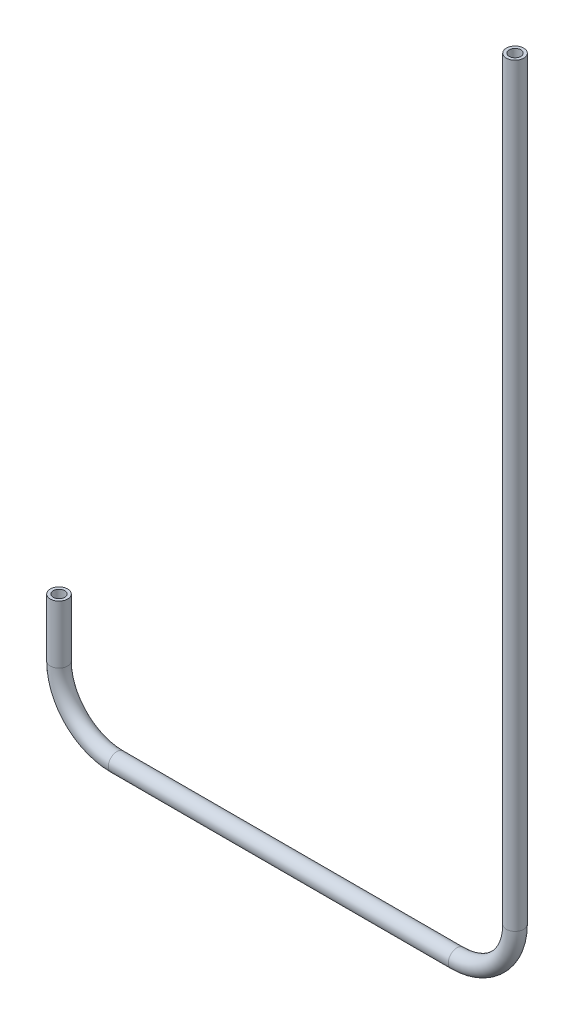
ISO-10303-21;
HEADER;
FILE_DESCRIPTION(('STEP AP214'),'2;1');
FILE_NAME('part.step','',(''),(''),'','','');
FILE_SCHEMA(('AUTOMOTIVE_DESIGN { 1 0 10303 214 1 1 1 1 }'));
ENDSEC;
DATA;
#1=APPLICATION_CONTEXT('core data for automotive mechanical design processes');
#2=APPLICATION_PROTOCOL_DEFINITION('international standard','automotive_design',2000,#1);
#3=PRODUCT_CONTEXT('',#1,'mechanical');
#4=PRODUCT('Part','Part','',(#3));
#5=PRODUCT_RELATED_PRODUCT_CATEGORY('part','',(#4));
#6=PRODUCT_DEFINITION_FORMATION('','',#4);
#7=PRODUCT_DEFINITION_CONTEXT('part definition',#1,'design');
#8=PRODUCT_DEFINITION('design','',#6,#7);
#9=PRODUCT_DEFINITION_SHAPE('','',#8);
#10=(LENGTH_UNIT() NAMED_UNIT(*) SI_UNIT(.MILLI.,.METRE.));
#11=(NAMED_UNIT(*) PLANE_ANGLE_UNIT() SI_UNIT($,.RADIAN.));
#12=(NAMED_UNIT(*) SI_UNIT($,.STERADIAN.) SOLID_ANGLE_UNIT());
#13=UNCERTAINTY_MEASURE_WITH_UNIT(LENGTH_MEASURE(1.E-05),#10,'distance_accuracy_value','');
#14=(GEOMETRIC_REPRESENTATION_CONTEXT(3) GLOBAL_UNCERTAINTY_ASSIGNED_CONTEXT((#13)) GLOBAL_UNIT_ASSIGNED_CONTEXT((#10,
#11,#12)) REPRESENTATION_CONTEXT('',''));
#15=CARTESIAN_POINT('',(0.,0.,0.));
#16=DIRECTION('',(0.,0.,1.));
#17=DIRECTION('',(1.,0.,0.));
#18=AXIS2_PLACEMENT_3D('',#15,#16,#17);
#19=CARTESIAN_POINT('',(0.,10.,0.));
#20=DIRECTION('',(0.,-1.,0.));
#21=DIRECTION('',(1.,0.,0.));
#22=AXIS2_PLACEMENT_3D('',#19,#20,#21);
#23=CYLINDRICAL_SURFACE('',#22,0.75);
#24=CARTESIAN_POINT('',(0.,5.,0.));
#25=DIRECTION('',(0.,-1.,0.));
#26=DIRECTION('',(1.,0.,0.));
#27=AXIS2_PLACEMENT_3D('',#24,#25,#26);
#28=CIRCLE('',#27,0.75);
#29=CARTESIAN_POINT('',(0.75,5.,0.));
#30=VERTEX_POINT('',#29);
#31=CARTESIAN_POINT('',(-0.75,5.,0.));
#32=VERTEX_POINT('',#31);
#33=EDGE_CURVE('E164',#30,#32,#28,.T.);
#34=ORIENTED_EDGE('',*,*,#33,.F.);
#35=CARTESIAN_POINT('',(0.,5.,0.));
#36=DIRECTION('',(0.,-1.,0.));
#37=DIRECTION('',(1.,0.,0.));
#38=AXIS2_PLACEMENT_3D('',#35,#36,#37);
#39=CIRCLE('',#38,0.75);
#40=EDGE_CURVE('E21',#32,#30,#39,.T.);
#41=ORIENTED_EDGE('',*,*,#40,.F.);
#42=DIRECTION('',(0.,1.,0.));
#43=VECTOR('',#42,1.);
#44=CARTESIAN_POINT('',(-0.75,10.,0.));
#45=LINE('',#44,#43);
#46=CARTESIAN_POINT('',(-0.75,10.,0.));
#47=VERTEX_POINT('',#46);
#48=EDGE_CURVE('E11',#32,#47,#45,.T.);
#49=ORIENTED_EDGE('',*,*,#48,.T.);
#50=CARTESIAN_POINT('',(0.,10.,0.));
#51=DIRECTION('',(0.,-1.,0.));
#52=DIRECTION('',(1.,0.,0.));
#53=AXIS2_PLACEMENT_3D('',#50,#51,#52);
#54=CIRCLE('',#53,0.75);
#55=EDGE_CURVE('E194',#47,#47,#54,.T.);
#56=ORIENTED_EDGE('',*,*,#55,.T.);
#57=ORIENTED_EDGE('',*,*,#48,.F.);
#58=EDGE_LOOP('',(#34,#41,#49,#56,#57));
#59=FACE_BOUND('',#58,.T.);
#60=ADVANCED_FACE('F17',(#59),#23,.T.);
#61=CARTESIAN_POINT('',(5.,5.,0.));
#62=DIRECTION('',(0.,0.,1.));
#63=DIRECTION('',(1.,0.,0.));
#64=AXIS2_PLACEMENT_3D('',#61,#62,#63);
#65=TOROIDAL_SURFACE('',#64,5.,0.75);
#66=CARTESIAN_POINT('',(5.,0.,0.));
#67=DIRECTION('',(1.,0.,0.));
#68=DIRECTION('',(0.,1.,0.));
#69=AXIS2_PLACEMENT_3D('',#66,#67,#68);
#70=CIRCLE('',#69,0.75);
#71=CARTESIAN_POINT('',(5.,0.75,0.));
#72=VERTEX_POINT('',#71);
#73=CARTESIAN_POINT('',(5.,-0.75,0.));
#74=VERTEX_POINT('',#73);
#75=EDGE_CURVE('E152',#72,#74,#70,.T.);
#76=ORIENTED_EDGE('',*,*,#75,.F.);
#77=CARTESIAN_POINT('',(5.,5.,0.));
#78=DIRECTION('',(0.,0.,-1.));
#79=DIRECTION('',(1.,0.,0.));
#80=AXIS2_PLACEMENT_3D('',#77,#78,#79);
#81=CIRCLE('',#80,4.25);
#82=EDGE_CURVE('E167',#72,#30,#81,.T.);
#83=ORIENTED_EDGE('',*,*,#82,.T.);
#84=ORIENTED_EDGE('',*,*,#33,.T.);
#85=ORIENTED_EDGE('',*,*,#40,.T.);
#86=ORIENTED_EDGE('',*,*,#82,.F.);
#87=CARTESIAN_POINT('',(5.,0.,0.));
#88=DIRECTION('',(1.,0.,0.));
#89=DIRECTION('',(0.,1.,0.));
#90=AXIS2_PLACEMENT_3D('',#87,#88,#89);
#91=CIRCLE('',#90,0.75);
#92=EDGE_CURVE('E148',#74,#72,#91,.T.);
#93=ORIENTED_EDGE('',*,*,#92,.F.);
#94=EDGE_LOOP('',(#76,#83,#84,#85,#86,#93));
#95=FACE_BOUND('',#94,.T.);
#96=ADVANCED_FACE('F332',(#95),#65,.T.);
#97=CARTESIAN_POINT('',(5.,0.,0.));
#98=DIRECTION('',(1.,0.,0.));
#99=DIRECTION('',(0.,1.,0.));
#100=AXIS2_PLACEMENT_3D('',#97,#98,#99);
#101=CYLINDRICAL_SURFACE('',#100,0.75);
#102=CARTESIAN_POINT('',(34.29,0.,0.));
#103=DIRECTION('',(1.,0.,0.));
#104=DIRECTION('',(0.,1.,0.));
#105=AXIS2_PLACEMENT_3D('',#102,#103,#104);
#106=CIRCLE('',#105,0.75);
#107=CARTESIAN_POINT('',(34.29,0.75,0.));
#108=VERTEX_POINT('',#107);
#109=CARTESIAN_POINT('',(34.29,-0.75,0.));
#110=VERTEX_POINT('',#109);
#111=EDGE_CURVE('E157',#108,#110,#106,.T.);
#112=ORIENTED_EDGE('',*,*,#111,.F.);
#113=CARTESIAN_POINT('',(34.29,0.,0.));
#114=DIRECTION('',(1.,0.,0.));
#115=DIRECTION('',(0.,1.,0.));
#116=AXIS2_PLACEMENT_3D('',#113,#114,#115);
#117=CIRCLE('',#116,0.75);
#118=EDGE_CURVE('E154',#110,#108,#117,.T.);
#119=ORIENTED_EDGE('',*,*,#118,.F.);
#120=DIRECTION('',(-1.,0.,0.));
#121=VECTOR('',#120,1.);
#122=CARTESIAN_POINT('',(5.,-0.75,0.));
#123=LINE('',#122,#121);
#124=EDGE_CURVE('E153',#110,#74,#123,.T.);
#125=ORIENTED_EDGE('',*,*,#124,.T.);
#126=ORIENTED_EDGE('',*,*,#92,.T.);
#127=ORIENTED_EDGE('',*,*,#75,.T.);
#128=ORIENTED_EDGE('',*,*,#124,.F.);
#129=EDGE_LOOP('',(#112,#119,#125,#126,#127,#128));
#130=FACE_BOUND('',#129,.T.);
#131=ADVANCED_FACE('F19',(#130),#101,.T.);
#132=CARTESIAN_POINT('',(34.29,5.,0.));
#133=DIRECTION('',(0.,0.,1.));
#134=DIRECTION('',(0.,1.,0.));
#135=AXIS2_PLACEMENT_3D('',#132,#133,#134);
#136=TOROIDAL_SURFACE('',#135,5.,0.75);
#137=CARTESIAN_POINT('',(39.29,5.,0.));
#138=DIRECTION('',(0.,1.,0.));
#139=DIRECTION('',(-1.,0.,0.));
#140=AXIS2_PLACEMENT_3D('',#137,#138,#139);
#141=CIRCLE('',#140,0.75);
#142=CARTESIAN_POINT('',(38.54,5.,0.));
#143=VERTEX_POINT('',#142);
#144=CARTESIAN_POINT('',(40.04,5.,0.));
#145=VERTEX_POINT('',#144);
#146=EDGE_CURVE('E143',#143,#145,#141,.T.);
#147=ORIENTED_EDGE('',*,*,#146,.F.);
#148=CARTESIAN_POINT('',(34.29,5.,0.));
#149=DIRECTION('',(0.,0.,-1.));
#150=DIRECTION('',(0.,1.,0.));
#151=AXIS2_PLACEMENT_3D('',#148,#149,#150);
#152=CIRCLE('',#151,4.25);
#153=EDGE_CURVE('E145',#143,#108,#152,.T.);
#154=ORIENTED_EDGE('',*,*,#153,.T.);
#155=ORIENTED_EDGE('',*,*,#111,.T.);
#156=ORIENTED_EDGE('',*,*,#118,.T.);
#157=ORIENTED_EDGE('',*,*,#153,.F.);
#158=CARTESIAN_POINT('',(39.29,5.,0.));
#159=DIRECTION('',(0.,1.,0.));
#160=DIRECTION('',(-1.,0.,0.));
#161=AXIS2_PLACEMENT_3D('',#158,#159,#160);
#162=CIRCLE('',#161,0.75);
#163=EDGE_CURVE('E146',#145,#143,#162,.T.);
#164=ORIENTED_EDGE('',*,*,#163,.F.);
#165=EDGE_LOOP('',(#147,#154,#155,#156,#157,#164));
#166=FACE_BOUND('',#165,.T.);
#167=ADVANCED_FACE('F345',(#166),#136,.T.);
#168=CARTESIAN_POINT('',(39.29,5.,0.));
#169=DIRECTION('',(0.,1.,0.));
#170=DIRECTION('',(-1.,0.,0.));
#171=AXIS2_PLACEMENT_3D('',#168,#169,#170);
#172=CYLINDRICAL_SURFACE('',#171,0.75);
#173=CARTESIAN_POINT('',(39.29,70.,0.));
#174=DIRECTION('',(0.,1.,0.));
#175=DIRECTION('',(-1.,0.,0.));
#176=AXIS2_PLACEMENT_3D('',#173,#174,#175);
#177=CIRCLE('',#176,0.75);
#178=CARTESIAN_POINT('',(40.04,70.,0.));
#179=VERTEX_POINT('',#178);
#180=EDGE_CURVE('E158',#179,#179,#177,.T.);
#181=ORIENTED_EDGE('',*,*,#180,.F.);
#182=DIRECTION('',(0.,-1.,0.));
#183=VECTOR('',#182,1.);
#184=CARTESIAN_POINT('',(40.04,5.,0.));
#185=LINE('',#184,#183);
#186=EDGE_CURVE('E162',#179,#145,#185,.T.);
#187=ORIENTED_EDGE('',*,*,#186,.T.);
#188=ORIENTED_EDGE('',*,*,#163,.T.);
#189=ORIENTED_EDGE('',*,*,#146,.T.);
#190=ORIENTED_EDGE('',*,*,#186,.F.);
#191=EDGE_LOOP('',(#181,#187,#188,#189,#190));
#192=FACE_BOUND('',#191,.T.);
#193=ADVANCED_FACE('F314',(#192),#172,.T.);
#194=CARTESIAN_POINT('',(39.29,70.,0.));
#195=DIRECTION('',(0.,1.,0.));
#196=DIRECTION('',(1.,0.,0.));
#197=AXIS2_PLACEMENT_3D('',#194,#195,#196);
#198=PLANE('',#197);
#199=CARTESIAN_POINT('',(39.29,70.,0.));
#200=DIRECTION('',(0.,-1.,0.));
#201=DIRECTION('',(-1.,0.,0.));
#202=AXIS2_PLACEMENT_3D('',#199,#200,#201);
#203=CIRCLE('',#202,0.5);
#204=CARTESIAN_POINT('',(39.79,70.,0.));
#205=VERTEX_POINT('',#204);
#206=EDGE_CURVE('E163',#205,#205,#203,.T.);
#207=ORIENTED_EDGE('',*,*,#206,.T.);
#208=EDGE_LOOP('',(#207));
#209=FACE_BOUND('',#208,.T.);
#210=ORIENTED_EDGE('',*,*,#180,.T.);
#211=EDGE_LOOP('',(#210));
#212=FACE_BOUND('',#211,.T.);
#213=ADVANCED_FACE('F309',(#209,#212),#198,.T.);
#214=CARTESIAN_POINT('',(39.29,5.,0.));
#215=DIRECTION('',(0.,1.,0.));
#216=DIRECTION('',(-1.,0.,0.));
#217=AXIS2_PLACEMENT_3D('',#214,#215,#216);
#218=CYLINDRICAL_SURFACE('',#217,0.5);
#219=CARTESIAN_POINT('',(39.29,5.,0.));
#220=DIRECTION('',(0.,-1.,0.));
#221=DIRECTION('',(1.,0.,0.));
#222=AXIS2_PLACEMENT_3D('',#219,#220,#221);
#223=CIRCLE('',#222,0.5);
#224=CARTESIAN_POINT('',(39.79,5.,0.));
#225=VERTEX_POINT('',#224);
#226=CARTESIAN_POINT('',(38.79,5.,0.));
#227=VERTEX_POINT('',#226);
#228=EDGE_CURVE('E209',#225,#227,#223,.T.);
#229=ORIENTED_EDGE('',*,*,#228,.T.);
#230=CARTESIAN_POINT('',(39.29,5.,0.));
#231=DIRECTION('',(0.,-1.,0.));
#232=DIRECTION('',(1.,0.,0.));
#233=AXIS2_PLACEMENT_3D('',#230,#231,#232);
#234=CIRCLE('',#233,0.5);
#235=EDGE_CURVE('E141',#227,#225,#234,.T.);
#236=ORIENTED_EDGE('',*,*,#235,.T.);
#237=DIRECTION('',(0.,1.,0.));
#238=VECTOR('',#237,1.);
#239=CARTESIAN_POINT('',(39.79,5.,0.));
#240=LINE('',#239,#238);
#241=EDGE_CURVE('E235',#225,#205,#240,.T.);
#242=ORIENTED_EDGE('',*,*,#241,.T.);
#243=ORIENTED_EDGE('',*,*,#206,.F.);
#244=ORIENTED_EDGE('',*,*,#241,.F.);
#245=EDGE_LOOP('',(#229,#236,#242,#243,#244));
#246=FACE_BOUND('',#245,.T.);
#247=ADVANCED_FACE('F247',(#246),#218,.F.);
#248=CARTESIAN_POINT('',(34.29,5.,0.));
#249=DIRECTION('',(0.,0.,1.));
#250=DIRECTION('',(0.,1.,0.));
#251=AXIS2_PLACEMENT_3D('',#248,#249,#250);
#252=TOROIDAL_SURFACE('',#251,5.,0.5);
#253=CARTESIAN_POINT('',(34.29,0.,0.));
#254=DIRECTION('',(-1.,0.,0.));
#255=DIRECTION('',(0.,1.,0.));
#256=AXIS2_PLACEMENT_3D('',#253,#254,#255);
#257=CIRCLE('',#256,0.5);
#258=CARTESIAN_POINT('',(34.29,0.5,0.));
#259=VERTEX_POINT('',#258);
#260=CARTESIAN_POINT('',(34.29,-0.5,0.));
#261=VERTEX_POINT('',#260);
#262=EDGE_CURVE('E199',#259,#261,#257,.T.);
#263=ORIENTED_EDGE('',*,*,#262,.T.);
#264=CARTESIAN_POINT('',(34.29,0.,0.));
#265=DIRECTION('',(-1.,0.,0.));
#266=DIRECTION('',(0.,1.,0.));
#267=AXIS2_PLACEMENT_3D('',#264,#265,#266);
#268=CIRCLE('',#267,0.5);
#269=EDGE_CURVE('E195',#261,#259,#268,.T.);
#270=ORIENTED_EDGE('',*,*,#269,.T.);
#271=CARTESIAN_POINT('',(34.29,5.,0.));
#272=DIRECTION('',(0.,0.,1.));
#273=DIRECTION('',(0.,1.,0.));
#274=AXIS2_PLACEMENT_3D('',#271,#272,#273);
#275=CIRCLE('',#274,4.5);
#276=EDGE_CURVE('E198',#259,#227,#275,.T.);
#277=ORIENTED_EDGE('',*,*,#276,.T.);
#278=ORIENTED_EDGE('',*,*,#228,.F.);
#279=ORIENTED_EDGE('',*,*,#235,.F.);
#280=ORIENTED_EDGE('',*,*,#276,.F.);
#281=EDGE_LOOP('',(#263,#270,#277,#278,#279,#280));
#282=FACE_BOUND('',#281,.T.);
#283=ADVANCED_FACE('F249',(#282),#252,.F.);
#284=CARTESIAN_POINT('',(5.,0.,0.));
#285=DIRECTION('',(1.,0.,0.));
#286=DIRECTION('',(0.,1.,0.));
#287=AXIS2_PLACEMENT_3D('',#284,#285,#286);
#288=CYLINDRICAL_SURFACE('',#287,0.5);
#289=CARTESIAN_POINT('',(5.,0.,0.));
#290=DIRECTION('',(-1.,0.,0.));
#291=DIRECTION('',(0.,-1.,0.));
#292=AXIS2_PLACEMENT_3D('',#289,#290,#291);
#293=CIRCLE('',#292,0.5);
#294=CARTESIAN_POINT('',(5.,-0.5,0.));
#295=VERTEX_POINT('',#294);
#296=CARTESIAN_POINT('',(5.,0.5,0.));
#297=VERTEX_POINT('',#296);
#298=EDGE_CURVE('E119',#295,#297,#293,.T.);
#299=ORIENTED_EDGE('',*,*,#298,.T.);
#300=CARTESIAN_POINT('',(5.,0.,0.));
#301=DIRECTION('',(-1.,0.,0.));
#302=DIRECTION('',(0.,-1.,0.));
#303=AXIS2_PLACEMENT_3D('',#300,#301,#302);
#304=CIRCLE('',#303,0.5);
#305=EDGE_CURVE('E112',#297,#295,#304,.T.);
#306=ORIENTED_EDGE('',*,*,#305,.T.);
#307=DIRECTION('',(1.,0.,0.));
#308=VECTOR('',#307,1.);
#309=CARTESIAN_POINT('',(5.,-0.5,0.));
#310=LINE('',#309,#308);
#311=EDGE_CURVE('E123',#295,#261,#310,.T.);
#312=ORIENTED_EDGE('',*,*,#311,.T.);
#313=ORIENTED_EDGE('',*,*,#262,.F.);
#314=ORIENTED_EDGE('',*,*,#269,.F.);
#315=ORIENTED_EDGE('',*,*,#311,.F.);
#316=EDGE_LOOP('',(#299,#306,#312,#313,#314,#315));
#317=FACE_BOUND('',#316,.T.);
#318=ADVANCED_FACE('F125',(#317),#288,.F.);
#319=CARTESIAN_POINT('',(5.,5.,0.));
#320=DIRECTION('',(0.,0.,1.));
#321=DIRECTION('',(1.,0.,0.));
#322=AXIS2_PLACEMENT_3D('',#319,#320,#321);
#323=TOROIDAL_SURFACE('',#322,5.,0.5);
#324=CARTESIAN_POINT('',(0.,5.,0.));
#325=DIRECTION('',(0.,1.,0.));
#326=DIRECTION('',(1.,0.,0.));
#327=AXIS2_PLACEMENT_3D('',#324,#325,#326);
#328=CIRCLE('',#327,0.5);
#329=CARTESIAN_POINT('',(0.5,5.,0.));
#330=VERTEX_POINT('',#329);
#331=CARTESIAN_POINT('',(-0.5,5.,0.));
#332=VERTEX_POINT('',#331);
#333=EDGE_CURVE('E137',#330,#332,#328,.T.);
#334=ORIENTED_EDGE('',*,*,#333,.T.);
#335=CARTESIAN_POINT('',(0.,5.,0.));
#336=DIRECTION('',(0.,1.,0.));
#337=DIRECTION('',(1.,0.,0.));
#338=AXIS2_PLACEMENT_3D('',#335,#336,#337);
#339=CIRCLE('',#338,0.5);
#340=EDGE_CURVE('E129',#332,#330,#339,.T.);
#341=ORIENTED_EDGE('',*,*,#340,.T.);
#342=CARTESIAN_POINT('',(5.,5.,0.));
#343=DIRECTION('',(0.,0.,1.));
#344=DIRECTION('',(1.,0.,0.));
#345=AXIS2_PLACEMENT_3D('',#342,#343,#344);
#346=CIRCLE('',#345,4.5);
#347=EDGE_CURVE('E117',#330,#297,#346,.T.);
#348=ORIENTED_EDGE('',*,*,#347,.T.);
#349=ORIENTED_EDGE('',*,*,#298,.F.);
#350=ORIENTED_EDGE('',*,*,#305,.F.);
#351=ORIENTED_EDGE('',*,*,#347,.F.);
#352=EDGE_LOOP('',(#334,#341,#348,#349,#350,#351));
#353=FACE_BOUND('',#352,.T.);
#354=ADVANCED_FACE('F115',(#353),#323,.F.);
#355=CARTESIAN_POINT('',(0.,10.,0.));
#356=DIRECTION('',(0.,-1.,0.));
#357=DIRECTION('',(1.,0.,0.));
#358=AXIS2_PLACEMENT_3D('',#355,#356,#357);
#359=CYLINDRICAL_SURFACE('',#358,0.5);
#360=CARTESIAN_POINT('',(0.,10.,0.));
#361=DIRECTION('',(0.,1.,0.));
#362=DIRECTION('',(1.,0.,0.));
#363=AXIS2_PLACEMENT_3D('',#360,#361,#362);
#364=CIRCLE('',#363,0.5);
#365=CARTESIAN_POINT('',(-0.5,10.,0.));
#366=VERTEX_POINT('',#365);
#367=EDGE_CURVE('E189',#366,#366,#364,.T.);
#368=ORIENTED_EDGE('',*,*,#367,.T.);
#369=DIRECTION('',(0.,-1.,0.));
#370=VECTOR('',#369,1.);
#371=CARTESIAN_POINT('',(-0.5,10.,0.));
#372=LINE('',#371,#370);
#373=EDGE_CURVE('E193',#366,#332,#372,.T.);
#374=ORIENTED_EDGE('',*,*,#373,.T.);
#375=ORIENTED_EDGE('',*,*,#333,.F.);
#376=ORIENTED_EDGE('',*,*,#340,.F.);
#377=ORIENTED_EDGE('',*,*,#373,.F.);
#378=EDGE_LOOP('',(#368,#374,#375,#376,#377));
#379=FACE_BOUND('',#378,.T.);
#380=ADVANCED_FACE('F321',(#379),#359,.F.);
#381=CARTESIAN_POINT('',(0.,10.,0.));
#382=DIRECTION('',(0.,-1.,0.));
#383=DIRECTION('',(0.,0.,-1.));
#384=AXIS2_PLACEMENT_3D('',#381,#382,#383);
#385=PLANE('',#384);
#386=ORIENTED_EDGE('',*,*,#367,.F.);
#387=EDGE_LOOP('',(#386));
#388=FACE_BOUND('',#387,.T.);
#389=ORIENTED_EDGE('',*,*,#55,.F.);
#390=EDGE_LOOP('',(#389));
#391=FACE_BOUND('',#390,.T.);
#392=ADVANCED_FACE('F326',(#388,#391),#385,.F.);
#393=CLOSED_SHELL('',(#60,#96,#131,#167,#193,#213,#247,#283,#318,#354,#380,#392));
#394=MANIFOLD_SOLID_BREP('B1',#393);
#395=ADVANCED_BREP_SHAPE_REPRESENTATION('',(#18,#394),#14);
#396=SHAPE_DEFINITION_REPRESENTATION(#9,#395);
ENDSEC;
END-ISO-10303-21;
